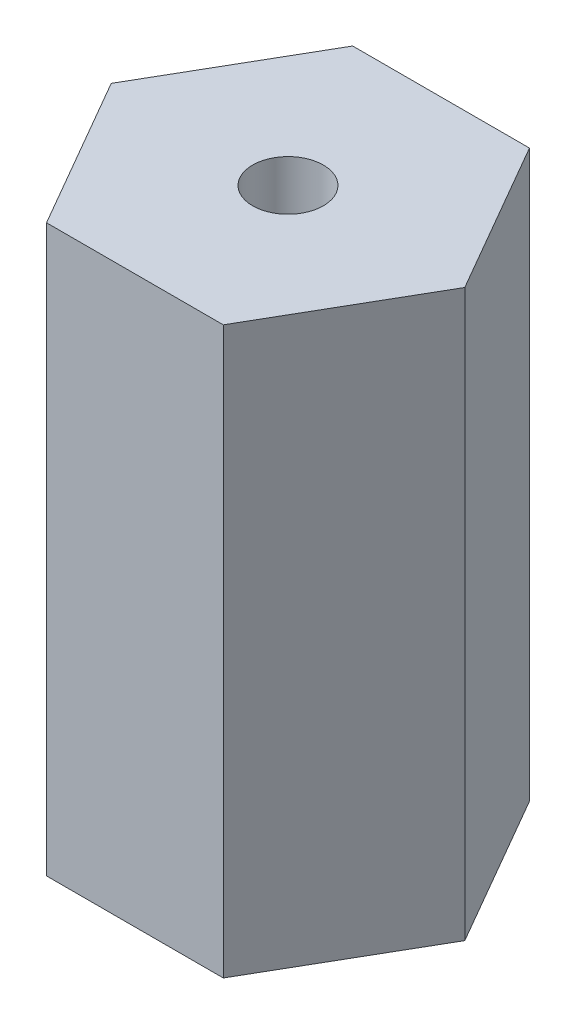
ISO-10303-21;
HEADER;
FILE_DESCRIPTION(('STEP AP214'),'2;1');
FILE_NAME('part.step','',(''),(''),'','','');
FILE_SCHEMA(('AUTOMOTIVE_DESIGN { 1 0 10303 214 1 1 1 1 }'));
ENDSEC;
DATA;
#1=APPLICATION_CONTEXT('core data for automotive mechanical design processes');
#2=APPLICATION_PROTOCOL_DEFINITION('international standard','automotive_design',2000,#1);
#3=PRODUCT_CONTEXT('',#1,'mechanical');
#4=PRODUCT('Part','Part','',(#3));
#5=PRODUCT_RELATED_PRODUCT_CATEGORY('part','',(#4));
#6=PRODUCT_DEFINITION_FORMATION('','',#4);
#7=PRODUCT_DEFINITION_CONTEXT('part definition',#1,'design');
#8=PRODUCT_DEFINITION('design','',#6,#7);
#9=PRODUCT_DEFINITION_SHAPE('','',#8);
#10=(LENGTH_UNIT() NAMED_UNIT(*) SI_UNIT(.MILLI.,.METRE.));
#11=(NAMED_UNIT(*) PLANE_ANGLE_UNIT() SI_UNIT($,.RADIAN.));
#12=(NAMED_UNIT(*) SI_UNIT($,.STERADIAN.) SOLID_ANGLE_UNIT());
#13=UNCERTAINTY_MEASURE_WITH_UNIT(LENGTH_MEASURE(1.E-05),#10,'distance_accuracy_value','');
#14=(GEOMETRIC_REPRESENTATION_CONTEXT(3) GLOBAL_UNCERTAINTY_ASSIGNED_CONTEXT((#13)) GLOBAL_UNIT_ASSIGNED_CONTEXT((#10,
#11,#12)) REPRESENTATION_CONTEXT('',''));
#15=CARTESIAN_POINT('',(0.,0.,0.));
#16=DIRECTION('',(0.,0.,1.));
#17=DIRECTION('',(1.,0.,0.));
#18=AXIS2_PLACEMENT_3D('',#15,#16,#17);
#19=CARTESIAN_POINT('',(0.,16.,0.));
#20=DIRECTION('',(0.,1.,0.));
#21=DIRECTION('',(0.,0.,1.));
#22=AXIS2_PLACEMENT_3D('',#19,#20,#21);
#23=PLANE('',#22);
#24=DIRECTION('',(0.5,0.,-0.866025403784439));
#25=VECTOR('',#24,1.);
#26=CARTESIAN_POINT('',(2.5,16.,4.3301270189222));
#27=LINE('',#26,#25);
#28=CARTESIAN_POINT('',(2.5,16.,4.3301270189222));
#29=VERTEX_POINT('',#28);
#30=CARTESIAN_POINT('',(5.,16.,0.));
#31=VERTEX_POINT('',#30);
#32=EDGE_CURVE('E146',#29,#31,#27,.T.);
#33=ORIENTED_EDGE('',*,*,#32,.T.);
#34=DIRECTION('',(-0.5,0.,-0.866025403784438));
#35=VECTOR('',#34,1.);
#36=CARTESIAN_POINT('',(5.,16.,0.));
#37=LINE('',#36,#35);
#38=CARTESIAN_POINT('',(2.5,16.,-4.3301270189222));
#39=VERTEX_POINT('',#38);
#40=EDGE_CURVE('E94',#31,#39,#37,.T.);
#41=ORIENTED_EDGE('',*,*,#40,.T.);
#42=DIRECTION('',(-1.,0.,0.));
#43=VECTOR('',#42,1.);
#44=CARTESIAN_POINT('',(2.5,16.,-4.3301270189222));
#45=LINE('',#44,#43);
#46=CARTESIAN_POINT('',(-2.5,16.,-4.3301270189222));
#47=VERTEX_POINT('',#46);
#48=EDGE_CURVE('E107',#39,#47,#45,.T.);
#49=ORIENTED_EDGE('',*,*,#48,.T.);
#50=DIRECTION('',(-0.5,0.,0.866025403784439));
#51=VECTOR('',#50,1.);
#52=CARTESIAN_POINT('',(-2.5,16.,-4.3301270189222));
#53=LINE('',#52,#51);
#54=CARTESIAN_POINT('',(-5.,16.,0.));
#55=VERTEX_POINT('',#54);
#56=EDGE_CURVE('E101',#47,#55,#53,.T.);
#57=ORIENTED_EDGE('',*,*,#56,.T.);
#58=DIRECTION('',(0.5,0.,0.866025403784439));
#59=VECTOR('',#58,1.);
#60=CARTESIAN_POINT('',(-5.,16.,0.));
#61=LINE('',#60,#59);
#62=CARTESIAN_POINT('',(-2.5,16.,4.3301270189222));
#63=VERTEX_POINT('',#62);
#64=EDGE_CURVE('E105',#55,#63,#61,.T.);
#65=ORIENTED_EDGE('',*,*,#64,.T.);
#66=DIRECTION('',(1.,0.,0.));
#67=VECTOR('',#66,1.);
#68=CARTESIAN_POINT('',(-2.5,16.,4.3301270189222));
#69=LINE('',#68,#67);
#70=EDGE_CURVE('E57',#63,#29,#69,.T.);
#71=ORIENTED_EDGE('',*,*,#70,.T.);
#72=EDGE_LOOP('',(#33,#41,#49,#57,#65,#71));
#73=FACE_BOUND('',#72,.T.);
#74=CARTESIAN_POINT('',(0.,16.,0.));
#75=DIRECTION('',(0.,1.,0.));
#76=DIRECTION('',(0.,0.,1.));
#77=AXIS2_PLACEMENT_3D('',#74,#75,#76);
#78=CIRCLE('',#77,1.);
#79=CARTESIAN_POINT('',(0.,16.,1.));
#80=VERTEX_POINT('',#79);
#81=EDGE_CURVE('E134',#80,#80,#78,.T.);
#82=ORIENTED_EDGE('',*,*,#81,.F.);
#83=EDGE_LOOP('',(#82));
#84=FACE_BOUND('',#83,.T.);
#85=ADVANCED_FACE('F39',(#73,#84),#23,.T.);
#86=CARTESIAN_POINT('',(0.,0.,0.));
#87=DIRECTION('',(0.,1.,0.));
#88=DIRECTION('',(0.,0.,1.));
#89=AXIS2_PLACEMENT_3D('',#86,#87,#88);
#90=PLANE('',#89);
#91=DIRECTION('',(0.5,0.,-0.866025403784439));
#92=VECTOR('',#91,1.);
#93=CARTESIAN_POINT('',(2.5,0.,4.3301270189222));
#94=LINE('',#93,#92);
#95=CARTESIAN_POINT('',(2.5,0.,4.3301270189222));
#96=VERTEX_POINT('',#95);
#97=CARTESIAN_POINT('',(5.,0.,0.));
#98=VERTEX_POINT('',#97);
#99=EDGE_CURVE('E129',#96,#98,#94,.T.);
#100=ORIENTED_EDGE('',*,*,#99,.F.);
#101=DIRECTION('',(1.,0.,0.));
#102=VECTOR('',#101,1.);
#103=CARTESIAN_POINT('',(-2.5,0.,4.3301270189222));
#104=LINE('',#103,#102);
#105=CARTESIAN_POINT('',(-2.5,0.,4.3301270189222));
#106=VERTEX_POINT('',#105);
#107=EDGE_CURVE('E86',#106,#96,#104,.T.);
#108=ORIENTED_EDGE('',*,*,#107,.F.);
#109=DIRECTION('',(0.5,0.,0.866025403784439));
#110=VECTOR('',#109,1.);
#111=CARTESIAN_POINT('',(-5.,0.,0.));
#112=LINE('',#111,#110);
#113=CARTESIAN_POINT('',(-5.,0.,0.));
#114=VERTEX_POINT('',#113);
#115=EDGE_CURVE('E80',#114,#106,#112,.T.);
#116=ORIENTED_EDGE('',*,*,#115,.F.);
#117=DIRECTION('',(-0.5,0.,0.866025403784439));
#118=VECTOR('',#117,1.);
#119=CARTESIAN_POINT('',(-2.5,0.,-4.3301270189222));
#120=LINE('',#119,#118);
#121=CARTESIAN_POINT('',(-2.5,0.,-4.3301270189222));
#122=VERTEX_POINT('',#121);
#123=EDGE_CURVE('E116',#122,#114,#120,.T.);
#124=ORIENTED_EDGE('',*,*,#123,.F.);
#125=DIRECTION('',(-1.,0.,0.));
#126=VECTOR('',#125,1.);
#127=CARTESIAN_POINT('',(2.5,0.,-4.3301270189222));
#128=LINE('',#127,#126);
#129=CARTESIAN_POINT('',(2.5,0.,-4.3301270189222));
#130=VERTEX_POINT('',#129);
#131=EDGE_CURVE('E137',#130,#122,#128,.T.);
#132=ORIENTED_EDGE('',*,*,#131,.F.);
#133=DIRECTION('',(-0.5,0.,-0.866025403784438));
#134=VECTOR('',#133,1.);
#135=CARTESIAN_POINT('',(5.,0.,0.));
#136=LINE('',#135,#134);
#137=EDGE_CURVE('E133',#98,#130,#136,.T.);
#138=ORIENTED_EDGE('',*,*,#137,.F.);
#139=EDGE_LOOP('',(#100,#108,#116,#124,#132,#138));
#140=FACE_BOUND('',#139,.T.);
#141=CARTESIAN_POINT('',(0.,0.,0.));
#142=DIRECTION('',(0.,1.,0.));
#143=DIRECTION('',(0.,0.,1.));
#144=AXIS2_PLACEMENT_3D('',#141,#142,#143);
#145=CIRCLE('',#144,1.);
#146=CARTESIAN_POINT('',(0.,0.,1.));
#147=VERTEX_POINT('',#146);
#148=EDGE_CURVE('E243',#147,#147,#145,.T.);
#149=ORIENTED_EDGE('',*,*,#148,.T.);
#150=EDGE_LOOP('',(#149));
#151=FACE_BOUND('',#150,.T.);
#152=ADVANCED_FACE('F159',(#140,#151),#90,.F.);
#153=CARTESIAN_POINT('',(2.5,16.,4.3301270189222));
#154=DIRECTION('',(-0.866025403784439,0.,-0.5));
#155=DIRECTION('',(-0.5,0.,0.866025403784439));
#156=AXIS2_PLACEMENT_3D('',#153,#154,#155);
#157=PLANE('',#156);
#158=ORIENTED_EDGE('',*,*,#99,.T.);
#159=DIRECTION('',(0.,-1.,0.));
#160=VECTOR('',#159,1.);
#161=CARTESIAN_POINT('',(5.,16.,0.));
#162=LINE('',#161,#160);
#163=EDGE_CURVE('E11',#31,#98,#162,.T.);
#164=ORIENTED_EDGE('',*,*,#163,.F.);
#165=ORIENTED_EDGE('',*,*,#32,.F.);
#166=DIRECTION('',(0.,-1.,0.));
#167=VECTOR('',#166,1.);
#168=CARTESIAN_POINT('',(2.5,16.,4.3301270189222));
#169=LINE('',#168,#167);
#170=EDGE_CURVE('E125',#29,#96,#169,.T.);
#171=ORIENTED_EDGE('',*,*,#170,.T.);
#172=EDGE_LOOP('',(#158,#164,#165,#171));
#173=FACE_BOUND('',#172,.T.);
#174=ADVANCED_FACE('F41',(#173),#157,.F.);
#175=CARTESIAN_POINT('',(5.,16.,0.));
#176=DIRECTION('',(-0.866025403784438,0.,0.5));
#177=DIRECTION('',(0.5,0.,0.866025403784438));
#178=AXIS2_PLACEMENT_3D('',#175,#176,#177);
#179=PLANE('',#178);
#180=ORIENTED_EDGE('',*,*,#137,.T.);
#181=DIRECTION('',(0.,-1.,0.));
#182=VECTOR('',#181,1.);
#183=CARTESIAN_POINT('',(2.5,16.,-4.3301270189222));
#184=LINE('',#183,#182);
#185=EDGE_CURVE('E49',#39,#130,#184,.T.);
#186=ORIENTED_EDGE('',*,*,#185,.F.);
#187=ORIENTED_EDGE('',*,*,#40,.F.);
#188=ORIENTED_EDGE('',*,*,#163,.T.);
#189=EDGE_LOOP('',(#180,#186,#187,#188));
#190=FACE_BOUND('',#189,.T.);
#191=ADVANCED_FACE('F184',(#190),#179,.F.);
#192=CARTESIAN_POINT('',(2.5,16.,-4.3301270189222));
#193=DIRECTION('',(0.,0.,1.));
#194=DIRECTION('',(1.,0.,0.));
#195=AXIS2_PLACEMENT_3D('',#192,#193,#194);
#196=PLANE('',#195);
#197=ORIENTED_EDGE('',*,*,#131,.T.);
#198=DIRECTION('',(0.,-1.,0.));
#199=VECTOR('',#198,1.);
#200=CARTESIAN_POINT('',(-2.5,16.,-4.3301270189222));
#201=LINE('',#200,#199);
#202=EDGE_CURVE('E118',#47,#122,#201,.T.);
#203=ORIENTED_EDGE('',*,*,#202,.F.);
#204=ORIENTED_EDGE('',*,*,#48,.F.);
#205=ORIENTED_EDGE('',*,*,#185,.T.);
#206=EDGE_LOOP('',(#197,#203,#204,#205));
#207=FACE_BOUND('',#206,.T.);
#208=ADVANCED_FACE('F156',(#207),#196,.F.);
#209=CARTESIAN_POINT('',(-2.5,16.,-4.3301270189222));
#210=DIRECTION('',(0.866025403784439,0.,0.5));
#211=DIRECTION('',(0.5,0.,-0.866025403784439));
#212=AXIS2_PLACEMENT_3D('',#209,#210,#211);
#213=PLANE('',#212);
#214=ORIENTED_EDGE('',*,*,#123,.T.);
#215=DIRECTION('',(0.,-1.,0.));
#216=VECTOR('',#215,1.);
#217=CARTESIAN_POINT('',(-5.,16.,0.));
#218=LINE('',#217,#216);
#219=EDGE_CURVE('E113',#55,#114,#218,.T.);
#220=ORIENTED_EDGE('',*,*,#219,.F.);
#221=ORIENTED_EDGE('',*,*,#56,.F.);
#222=ORIENTED_EDGE('',*,*,#202,.T.);
#223=EDGE_LOOP('',(#214,#220,#221,#222));
#224=FACE_BOUND('',#223,.T.);
#225=ADVANCED_FACE('F114',(#224),#213,.F.);
#226=CARTESIAN_POINT('',(-5.,16.,0.));
#227=DIRECTION('',(0.866025403784439,0.,-0.5));
#228=DIRECTION('',(-0.5,0.,-0.866025403784439));
#229=AXIS2_PLACEMENT_3D('',#226,#227,#228);
#230=PLANE('',#229);
#231=ORIENTED_EDGE('',*,*,#115,.T.);
#232=DIRECTION('',(0.,-1.,0.));
#233=VECTOR('',#232,1.);
#234=CARTESIAN_POINT('',(-2.5,16.,4.3301270189222));
#235=LINE('',#234,#233);
#236=EDGE_CURVE('E119',#63,#106,#235,.T.);
#237=ORIENTED_EDGE('',*,*,#236,.F.);
#238=ORIENTED_EDGE('',*,*,#64,.F.);
#239=ORIENTED_EDGE('',*,*,#219,.T.);
#240=EDGE_LOOP('',(#231,#237,#238,#239));
#241=FACE_BOUND('',#240,.T.);
#242=ADVANCED_FACE('F121',(#241),#230,.F.);
#243=CARTESIAN_POINT('',(-2.5,16.,4.3301270189222));
#244=DIRECTION('',(0.,0.,-1.));
#245=DIRECTION('',(-1.,0.,0.));
#246=AXIS2_PLACEMENT_3D('',#243,#244,#245);
#247=PLANE('',#246);
#248=ORIENTED_EDGE('',*,*,#107,.T.);
#249=ORIENTED_EDGE('',*,*,#170,.F.);
#250=ORIENTED_EDGE('',*,*,#70,.F.);
#251=ORIENTED_EDGE('',*,*,#236,.T.);
#252=EDGE_LOOP('',(#248,#249,#250,#251));
#253=FACE_BOUND('',#252,.T.);
#254=ADVANCED_FACE('F164',(#253),#247,.F.);
#255=CARTESIAN_POINT('',(0.,16.,0.));
#256=DIRECTION('',(0.,-1.,0.));
#257=DIRECTION('',(0.,0.,-1.));
#258=AXIS2_PLACEMENT_3D('',#255,#256,#257);
#259=CYLINDRICAL_SURFACE('',#258,1.);
#260=ORIENTED_EDGE('',*,*,#81,.T.);
#261=EDGE_LOOP('',(#260));
#262=FACE_BOUND('',#261,.T.);
#263=ORIENTED_EDGE('',*,*,#148,.F.);
#264=EDGE_LOOP('',(#263));
#265=FACE_BOUND('',#264,.T.);
#266=ADVANCED_FACE('F166',(#262,#265),#259,.F.);
#267=CLOSED_SHELL('',(#85,#152,#174,#191,#208,#225,#242,#254,#266));
#268=MANIFOLD_SOLID_BREP('B2',#267);
#269=ADVANCED_BREP_SHAPE_REPRESENTATION('',(#18,#268),#14);
#270=SHAPE_DEFINITION_REPRESENTATION(#9,#269);
ENDSEC;
END-ISO-10303-21;
